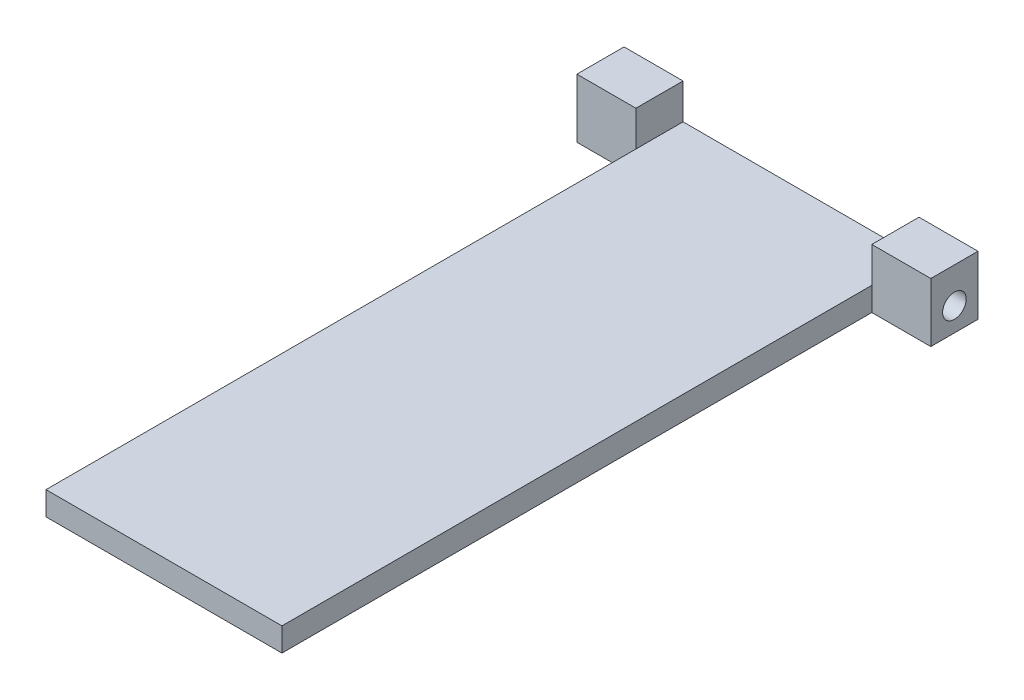
ISO-10303-21;
HEADER;
FILE_DESCRIPTION(('STEP AP214'),'2;1');
FILE_NAME('part.step','',(''),(''),'','','');
FILE_SCHEMA(('AUTOMOTIVE_DESIGN { 1 0 10303 214 1 1 1 1 }'));
ENDSEC;
DATA;
#1=APPLICATION_CONTEXT('core data for automotive mechanical design processes');
#2=APPLICATION_PROTOCOL_DEFINITION('international standard','automotive_design',2000,#1);
#3=PRODUCT_CONTEXT('',#1,'mechanical');
#4=PRODUCT('Part','Part','',(#3));
#5=PRODUCT_RELATED_PRODUCT_CATEGORY('part','',(#4));
#6=PRODUCT_DEFINITION_FORMATION('','',#4);
#7=PRODUCT_DEFINITION_CONTEXT('part definition',#1,'design');
#8=PRODUCT_DEFINITION('design','',#6,#7);
#9=PRODUCT_DEFINITION_SHAPE('','',#8);
#10=(LENGTH_UNIT() NAMED_UNIT(*) SI_UNIT(.MILLI.,.METRE.));
#11=(NAMED_UNIT(*) PLANE_ANGLE_UNIT() SI_UNIT($,.RADIAN.));
#12=(NAMED_UNIT(*) SI_UNIT($,.STERADIAN.) SOLID_ANGLE_UNIT());
#13=UNCERTAINTY_MEASURE_WITH_UNIT(LENGTH_MEASURE(1.E-05),#10,'distance_accuracy_value','');
#14=(GEOMETRIC_REPRESENTATION_CONTEXT(3) GLOBAL_UNCERTAINTY_ASSIGNED_CONTEXT((#13)) GLOBAL_UNIT_ASSIGNED_CONTEXT((#10,
#11,#12)) REPRESENTATION_CONTEXT('',''));
#15=CARTESIAN_POINT('',(0.,0.,0.));
#16=DIRECTION('',(0.,0.,1.));
#17=DIRECTION('',(1.,0.,0.));
#18=AXIS2_PLACEMENT_3D('',#15,#16,#17);
#19=CARTESIAN_POINT('',(-50.,-40.,85.));
#20=DIRECTION('',(-1.,0.,0.));
#21=DIRECTION('',(0.,-1.,0.));
#22=AXIS2_PLACEMENT_3D('',#19,#20,#21);
#23=PLANE('',#22);
#24=DIRECTION('',(0.,1.,0.));
#25=VECTOR('',#24,1.);
#26=CARTESIAN_POINT('',(-50.,-50.,-65.));
#27=LINE('',#26,#25);
#28=CARTESIAN_POINT('',(-50.,-50.,-65.));
#29=VERTEX_POINT('',#28);
#30=CARTESIAN_POINT('',(-50.,-40.,-65.));
#31=VERTEX_POINT('',#30);
#32=EDGE_CURVE('E69',#29,#31,#27,.T.);
#33=ORIENTED_EDGE('',*,*,#32,.F.);
#34=DIRECTION('',(0.,0.,-1.));
#35=VECTOR('',#34,1.);
#36=CARTESIAN_POINT('',(-50.,-50.,85.));
#37=LINE('',#36,#35);
#38=CARTESIAN_POINT('',(-50.,-50.,185.));
#39=VERTEX_POINT('',#38);
#40=EDGE_CURVE('E242',#39,#29,#37,.T.);
#41=ORIENTED_EDGE('',*,*,#40,.F.);
#42=DIRECTION('',(0.,-1.,0.));
#43=VECTOR('',#42,1.);
#44=CARTESIAN_POINT('',(-50.,-50.,185.));
#45=LINE('',#44,#43);
#46=CARTESIAN_POINT('',(-50.,-40.,185.));
#47=VERTEX_POINT('',#46);
#48=EDGE_CURVE('E152',#47,#39,#45,.T.);
#49=ORIENTED_EDGE('',*,*,#48,.F.);
#50=DIRECTION('',(0.,0.,-1.));
#51=VECTOR('',#50,1.);
#52=CARTESIAN_POINT('',(-50.,-40.,85.));
#53=LINE('',#52,#51);
#54=EDGE_CURVE('E243',#47,#31,#53,.T.);
#55=ORIENTED_EDGE('',*,*,#54,.T.);
#56=EDGE_LOOP('',(#33,#41,#49,#55));
#57=FACE_BOUND('',#56,.T.);
#58=ADVANCED_FACE('F45',(#57),#23,.T.);
#59=CARTESIAN_POINT('',(50.,-40.,-85.));
#60=DIRECTION('',(1.,0.,0.));
#61=DIRECTION('',(0.,1.,0.));
#62=AXIS2_PLACEMENT_3D('',#59,#60,#61);
#63=PLANE('',#62);
#64=DIRECTION('',(0.,-1.,0.));
#65=VECTOR('',#64,1.);
#66=CARTESIAN_POINT('',(50.,-50.,-65.));
#67=LINE('',#66,#65);
#68=CARTESIAN_POINT('',(50.,-40.,-65.));
#69=VERTEX_POINT('',#68);
#70=CARTESIAN_POINT('',(50.,-50.,-65.));
#71=VERTEX_POINT('',#70);
#72=EDGE_CURVE('E11',#69,#71,#67,.T.);
#73=ORIENTED_EDGE('',*,*,#72,.F.);
#74=DIRECTION('',(0.,0.,1.));
#75=VECTOR('',#74,1.);
#76=CARTESIAN_POINT('',(50.,-40.,-85.));
#77=LINE('',#76,#75);
#78=CARTESIAN_POINT('',(50.,-40.,185.));
#79=VERTEX_POINT('',#78);
#80=EDGE_CURVE('E142',#69,#79,#77,.T.);
#81=ORIENTED_EDGE('',*,*,#80,.T.);
#82=DIRECTION('',(0.,1.,0.));
#83=VECTOR('',#82,1.);
#84=CARTESIAN_POINT('',(50.,-40.,185.));
#85=LINE('',#84,#83);
#86=CARTESIAN_POINT('',(50.,-50.,185.));
#87=VERTEX_POINT('',#86);
#88=EDGE_CURVE('E140',#87,#79,#85,.T.);
#89=ORIENTED_EDGE('',*,*,#88,.F.);
#90=DIRECTION('',(0.,0.,1.));
#91=VECTOR('',#90,1.);
#92=CARTESIAN_POINT('',(50.,-50.,-85.));
#93=LINE('',#92,#91);
#94=EDGE_CURVE('E48',#71,#87,#93,.T.);
#95=ORIENTED_EDGE('',*,*,#94,.F.);
#96=EDGE_LOOP('',(#73,#81,#89,#95));
#97=FACE_BOUND('',#96,.T.);
#98=ADVANCED_FACE('F141',(#97),#63,.T.);
#99=CARTESIAN_POINT('',(-50.,-40.,-85.));
#100=DIRECTION('',(0.,0.,-1.));
#101=DIRECTION('',(-1.,0.,0.));
#102=AXIS2_PLACEMENT_3D('',#99,#100,#101);
#103=PLANE('',#102);
#104=DIRECTION('',(1.,0.,0.));
#105=VECTOR('',#104,1.);
#106=CARTESIAN_POINT('',(-50.,-50.,-85.));
#107=LINE('',#106,#105);
#108=CARTESIAN_POINT('',(-75.,-50.,-85.));
#109=VERTEX_POINT('',#108);
#110=CARTESIAN_POINT('',(75.,-50.,-85.));
#111=VERTEX_POINT('',#110);
#112=EDGE_CURVE('E138',#109,#111,#107,.T.);
#113=ORIENTED_EDGE('',*,*,#112,.F.);
#114=DIRECTION('',(0.,-1.,0.));
#115=VECTOR('',#114,1.);
#116=CARTESIAN_POINT('',(-75.,-25.,-85.));
#117=LINE('',#116,#115);
#118=CARTESIAN_POINT('',(-75.,-25.,-85.));
#119=VERTEX_POINT('',#118);
#120=EDGE_CURVE('E208',#119,#109,#117,.T.);
#121=ORIENTED_EDGE('',*,*,#120,.F.);
#122=DIRECTION('',(1.,0.,0.));
#123=VECTOR('',#122,1.);
#124=CARTESIAN_POINT('',(-75.,-25.,-85.));
#125=LINE('',#124,#123);
#126=CARTESIAN_POINT('',(-50.,-25.,-85.));
#127=VERTEX_POINT('',#126);
#128=EDGE_CURVE('E222',#119,#127,#125,.T.);
#129=ORIENTED_EDGE('',*,*,#128,.T.);
#130=DIRECTION('',(0.,-1.,0.));
#131=VECTOR('',#130,1.);
#132=CARTESIAN_POINT('',(-50.,-25.,-85.));
#133=LINE('',#132,#131);
#134=CARTESIAN_POINT('',(-50.,-40.,-85.));
#135=VERTEX_POINT('',#134);
#136=EDGE_CURVE('E207',#127,#135,#133,.T.);
#137=ORIENTED_EDGE('',*,*,#136,.T.);
#138=DIRECTION('',(1.,0.,0.));
#139=VECTOR('',#138,1.);
#140=CARTESIAN_POINT('',(-50.,-40.,-85.));
#141=LINE('',#140,#139);
#142=CARTESIAN_POINT('',(50.,-40.,-85.));
#143=VERTEX_POINT('',#142);
#144=EDGE_CURVE('E246',#135,#143,#141,.T.);
#145=ORIENTED_EDGE('',*,*,#144,.T.);
#146=DIRECTION('',(0.,1.,0.));
#147=VECTOR('',#146,1.);
#148=CARTESIAN_POINT('',(50.,-25.,-85.));
#149=LINE('',#148,#147);
#150=CARTESIAN_POINT('',(50.,-25.,-85.));
#151=VERTEX_POINT('',#150);
#152=EDGE_CURVE('E173',#143,#151,#149,.T.);
#153=ORIENTED_EDGE('',*,*,#152,.T.);
#154=DIRECTION('',(-1.,0.,0.));
#155=VECTOR('',#154,1.);
#156=CARTESIAN_POINT('',(75.,-25.,-85.));
#157=LINE('',#156,#155);
#158=CARTESIAN_POINT('',(75.,-25.,-85.));
#159=VERTEX_POINT('',#158);
#160=EDGE_CURVE('E203',#159,#151,#157,.T.);
#161=ORIENTED_EDGE('',*,*,#160,.F.);
#162=DIRECTION('',(0.,1.,0.));
#163=VECTOR('',#162,1.);
#164=CARTESIAN_POINT('',(75.,-25.,-85.));
#165=LINE('',#164,#163);
#166=EDGE_CURVE('E181',#111,#159,#165,.T.);
#167=ORIENTED_EDGE('',*,*,#166,.F.);
#168=EDGE_LOOP('',(#113,#121,#129,#137,#145,#153,#161,#167));
#169=FACE_BOUND('',#168,.T.);
#170=ADVANCED_FACE('F261',(#169),#103,.T.);
#171=CARTESIAN_POINT('',(0.,-40.,0.));
#172=DIRECTION('',(0.,-1.,0.));
#173=DIRECTION('',(1.,0.,0.));
#174=AXIS2_PLACEMENT_3D('',#171,#172,#173);
#175=PLANE('',#174);
#176=ORIENTED_EDGE('',*,*,#54,.F.);
#177=DIRECTION('',(-1.,0.,0.));
#178=VECTOR('',#177,1.);
#179=CARTESIAN_POINT('',(-50.,-40.,185.));
#180=LINE('',#179,#178);
#181=EDGE_CURVE('E147',#79,#47,#180,.T.);
#182=ORIENTED_EDGE('',*,*,#181,.F.);
#183=ORIENTED_EDGE('',*,*,#80,.F.);
#184=EDGE_CURVE('E54',#143,#69,#77,.T.);
#185=ORIENTED_EDGE('',*,*,#184,.F.);
#186=ORIENTED_EDGE('',*,*,#144,.F.);
#187=EDGE_CURVE('E137',#31,#135,#53,.T.);
#188=ORIENTED_EDGE('',*,*,#187,.F.);
#189=EDGE_LOOP('',(#176,#182,#183,#185,#186,#188));
#190=FACE_BOUND('',#189,.T.);
#191=ADVANCED_FACE('F275',(#190),#175,.F.);
#192=CARTESIAN_POINT('',(0.,-50.,0.));
#193=DIRECTION('',(0.,-1.,0.));
#194=DIRECTION('',(1.,0.,0.));
#195=AXIS2_PLACEMENT_3D('',#192,#193,#194);
#196=PLANE('',#195);
#197=ORIENTED_EDGE('',*,*,#40,.T.);
#198=DIRECTION('',(1.,0.,0.));
#199=VECTOR('',#198,1.);
#200=CARTESIAN_POINT('',(-75.,-50.,-65.));
#201=LINE('',#200,#199);
#202=CARTESIAN_POINT('',(-75.,-50.,-65.));
#203=VERTEX_POINT('',#202);
#204=EDGE_CURVE('E238',#203,#29,#201,.T.);
#205=ORIENTED_EDGE('',*,*,#204,.F.);
#206=DIRECTION('',(0.,0.,1.));
#207=VECTOR('',#206,1.);
#208=CARTESIAN_POINT('',(-75.,-50.,-85.));
#209=LINE('',#208,#207);
#210=EDGE_CURVE('E212',#109,#203,#209,.T.);
#211=ORIENTED_EDGE('',*,*,#210,.F.);
#212=ORIENTED_EDGE('',*,*,#112,.T.);
#213=DIRECTION('',(0.,0.,-1.));
#214=VECTOR('',#213,1.);
#215=CARTESIAN_POINT('',(75.,-50.,-85.));
#216=LINE('',#215,#214);
#217=CARTESIAN_POINT('',(75.,-50.,-65.));
#218=VERTEX_POINT('',#217);
#219=EDGE_CURVE('E177',#218,#111,#216,.T.);
#220=ORIENTED_EDGE('',*,*,#219,.F.);
#221=DIRECTION('',(-1.,0.,0.));
#222=VECTOR('',#221,1.);
#223=CARTESIAN_POINT('',(75.,-50.,-65.));
#224=LINE('',#223,#222);
#225=EDGE_CURVE('E135',#218,#71,#224,.T.);
#226=ORIENTED_EDGE('',*,*,#225,.T.);
#227=ORIENTED_EDGE('',*,*,#94,.T.);
#228=DIRECTION('',(1.,0.,0.));
#229=VECTOR('',#228,1.);
#230=CARTESIAN_POINT('',(50.,-50.,185.));
#231=LINE('',#230,#229);
#232=EDGE_CURVE('E132',#39,#87,#231,.T.);
#233=ORIENTED_EDGE('',*,*,#232,.F.);
#234=EDGE_LOOP('',(#197,#205,#211,#212,#220,#226,#227,#233));
#235=FACE_BOUND('',#234,.T.);
#236=ADVANCED_FACE('F130',(#235),#196,.T.);
#237=CARTESIAN_POINT('',(-50.,0.,0.));
#238=DIRECTION('',(-1.,0.,0.));
#239=DIRECTION('',(0.,0.,1.));
#240=AXIS2_PLACEMENT_3D('',#237,#238,#239);
#241=PLANE('',#240);
#242=CARTESIAN_POINT('',(-50.,-25.,-65.));
#243=VERTEX_POINT('',#242);
#244=EDGE_CURVE('E226',#31,#243,#27,.T.);
#245=ORIENTED_EDGE('',*,*,#244,.F.);
#246=ORIENTED_EDGE('',*,*,#187,.T.);
#247=ORIENTED_EDGE('',*,*,#136,.F.);
#248=DIRECTION('',(0.,0.,-1.));
#249=VECTOR('',#248,1.);
#250=CARTESIAN_POINT('',(-50.,-25.,-65.));
#251=LINE('',#250,#249);
#252=EDGE_CURVE('E213',#243,#127,#251,.T.);
#253=ORIENTED_EDGE('',*,*,#252,.F.);
#254=EDGE_LOOP('',(#245,#246,#247,#253));
#255=FACE_BOUND('',#254,.T.);
#256=ADVANCED_FACE('F283',(#255),#241,.F.);
#257=CARTESIAN_POINT('',(-75.,-50.,-65.));
#258=DIRECTION('',(0.,0.,-1.));
#259=DIRECTION('',(-1.,0.,0.));
#260=AXIS2_PLACEMENT_3D('',#257,#258,#259);
#261=PLANE('',#260);
#262=ORIENTED_EDGE('',*,*,#32,.T.);
#263=ORIENTED_EDGE('',*,*,#244,.T.);
#264=DIRECTION('',(1.,0.,0.));
#265=VECTOR('',#264,1.);
#266=CARTESIAN_POINT('',(-75.,-25.,-65.));
#267=LINE('',#266,#265);
#268=CARTESIAN_POINT('',(-75.,-25.,-65.));
#269=VERTEX_POINT('',#268);
#270=EDGE_CURVE('E234',#269,#243,#267,.T.);
#271=ORIENTED_EDGE('',*,*,#270,.F.);
#272=DIRECTION('',(0.,1.,0.));
#273=VECTOR('',#272,1.);
#274=CARTESIAN_POINT('',(-75.,-50.,-65.));
#275=LINE('',#274,#273);
#276=EDGE_CURVE('E216',#203,#269,#275,.T.);
#277=ORIENTED_EDGE('',*,*,#276,.F.);
#278=ORIENTED_EDGE('',*,*,#204,.T.);
#279=EDGE_LOOP('',(#262,#263,#271,#277,#278));
#280=FACE_BOUND('',#279,.T.);
#281=ADVANCED_FACE('F288',(#280),#261,.F.);
#282=CARTESIAN_POINT('',(-75.,-25.,-65.));
#283=DIRECTION('',(0.,-1.,0.));
#284=DIRECTION('',(1.,0.,0.));
#285=AXIS2_PLACEMENT_3D('',#282,#283,#284);
#286=PLANE('',#285);
#287=ORIENTED_EDGE('',*,*,#252,.T.);
#288=ORIENTED_EDGE('',*,*,#128,.F.);
#289=DIRECTION('',(0.,0.,-1.));
#290=VECTOR('',#289,1.);
#291=CARTESIAN_POINT('',(-75.,-25.,-65.));
#292=LINE('',#291,#290);
#293=EDGE_CURVE('E219',#269,#119,#292,.T.);
#294=ORIENTED_EDGE('',*,*,#293,.F.);
#295=ORIENTED_EDGE('',*,*,#270,.T.);
#296=EDGE_LOOP('',(#287,#288,#294,#295));
#297=FACE_BOUND('',#296,.T.);
#298=ADVANCED_FACE('F294',(#297),#286,.F.);
#299=CARTESIAN_POINT('',(-75.,0.,0.));
#300=DIRECTION('',(-1.,0.,0.));
#301=DIRECTION('',(0.,0.,1.));
#302=AXIS2_PLACEMENT_3D('',#299,#300,#301);
#303=PLANE('',#302);
#304=CARTESIAN_POINT('',(-75.,-40.,-75.));
#305=DIRECTION('',(-1.,0.,0.));
#306=DIRECTION('',(0.,0.,1.));
#307=AXIS2_PLACEMENT_3D('',#304,#305,#306);
#308=CIRCLE('',#307,5.00000000000001);
#309=CARTESIAN_POINT('',(-75.,-40.,-70.));
#310=VERTEX_POINT('',#309);
#311=EDGE_CURVE('E165',#310,#310,#308,.T.);
#312=ORIENTED_EDGE('',*,*,#311,.F.);
#313=EDGE_LOOP('',(#312));
#314=FACE_BOUND('',#313,.T.);
#315=ORIENTED_EDGE('',*,*,#120,.T.);
#316=ORIENTED_EDGE('',*,*,#210,.T.);
#317=ORIENTED_EDGE('',*,*,#276,.T.);
#318=ORIENTED_EDGE('',*,*,#293,.T.);
#319=EDGE_LOOP('',(#315,#316,#317,#318));
#320=FACE_BOUND('',#319,.T.);
#321=ADVANCED_FACE('F292',(#314,#320),#303,.T.);
#322=CARTESIAN_POINT('',(75.,-25.,-65.));
#323=DIRECTION('',(0.,-1.,0.));
#324=DIRECTION('',(1.,0.,0.));
#325=AXIS2_PLACEMENT_3D('',#322,#323,#324);
#326=PLANE('',#325);
#327=DIRECTION('',(0.,0.,1.));
#328=VECTOR('',#327,1.);
#329=CARTESIAN_POINT('',(50.,-25.,-65.));
#330=LINE('',#329,#328);
#331=CARTESIAN_POINT('',(50.,-25.,-65.));
#332=VERTEX_POINT('',#331);
#333=EDGE_CURVE('E192',#151,#332,#330,.T.);
#334=ORIENTED_EDGE('',*,*,#333,.T.);
#335=DIRECTION('',(-1.,0.,0.));
#336=VECTOR('',#335,1.);
#337=CARTESIAN_POINT('',(75.,-25.,-65.));
#338=LINE('',#337,#336);
#339=CARTESIAN_POINT('',(75.,-25.,-65.));
#340=VERTEX_POINT('',#339);
#341=EDGE_CURVE('E199',#340,#332,#338,.T.);
#342=ORIENTED_EDGE('',*,*,#341,.F.);
#343=DIRECTION('',(0.,0.,1.));
#344=VECTOR('',#343,1.);
#345=CARTESIAN_POINT('',(75.,-25.,-65.));
#346=LINE('',#345,#344);
#347=EDGE_CURVE('E184',#159,#340,#346,.T.);
#348=ORIENTED_EDGE('',*,*,#347,.F.);
#349=ORIENTED_EDGE('',*,*,#160,.T.);
#350=EDGE_LOOP('',(#334,#342,#348,#349));
#351=FACE_BOUND('',#350,.T.);
#352=ADVANCED_FACE('F302',(#351),#326,.F.);
#353=CARTESIAN_POINT('',(75.,-50.,-65.));
#354=DIRECTION('',(0.,0.,-1.));
#355=DIRECTION('',(0.,1.,0.));
#356=AXIS2_PLACEMENT_3D('',#353,#354,#355);
#357=PLANE('',#356);
#358=EDGE_CURVE('E56',#332,#69,#67,.T.);
#359=ORIENTED_EDGE('',*,*,#358,.T.);
#360=ORIENTED_EDGE('',*,*,#72,.T.);
#361=ORIENTED_EDGE('',*,*,#225,.F.);
#362=DIRECTION('',(0.,-1.,0.));
#363=VECTOR('',#362,1.);
#364=CARTESIAN_POINT('',(75.,-50.,-65.));
#365=LINE('',#364,#363);
#366=EDGE_CURVE('E187',#340,#218,#365,.T.);
#367=ORIENTED_EDGE('',*,*,#366,.F.);
#368=ORIENTED_EDGE('',*,*,#341,.T.);
#369=EDGE_LOOP('',(#359,#360,#361,#367,#368));
#370=FACE_BOUND('',#369,.T.);
#371=ADVANCED_FACE('F268',(#370),#357,.F.);
#372=CARTESIAN_POINT('',(75.,0.,0.));
#373=DIRECTION('',(-1.,0.,0.));
#374=DIRECTION('',(0.,0.,1.));
#375=AXIS2_PLACEMENT_3D('',#372,#373,#374);
#376=PLANE('',#375);
#377=CARTESIAN_POINT('',(75.,-40.,-75.));
#378=DIRECTION('',(1.,0.,0.));
#379=DIRECTION('',(0.,0.,-1.));
#380=AXIS2_PLACEMENT_3D('',#377,#378,#379);
#381=CIRCLE('',#380,5.00000000000001);
#382=CARTESIAN_POINT('',(75.,-40.,-80.));
#383=VERTEX_POINT('',#382);
#384=EDGE_CURVE('E160',#383,#383,#381,.T.);
#385=ORIENTED_EDGE('',*,*,#384,.F.);
#386=EDGE_LOOP('',(#385));
#387=FACE_BOUND('',#386,.T.);
#388=ORIENTED_EDGE('',*,*,#219,.T.);
#389=ORIENTED_EDGE('',*,*,#166,.T.);
#390=ORIENTED_EDGE('',*,*,#347,.T.);
#391=ORIENTED_EDGE('',*,*,#366,.T.);
#392=EDGE_LOOP('',(#388,#389,#390,#391));
#393=FACE_BOUND('',#392,.T.);
#394=ADVANCED_FACE('F264',(#387,#393),#376,.F.);
#395=CARTESIAN_POINT('',(50.,0.,0.));
#396=DIRECTION('',(-1.,0.,0.));
#397=DIRECTION('',(0.,0.,1.));
#398=AXIS2_PLACEMENT_3D('',#395,#396,#397);
#399=PLANE('',#398);
#400=ORIENTED_EDGE('',*,*,#152,.F.);
#401=ORIENTED_EDGE('',*,*,#184,.T.);
#402=ORIENTED_EDGE('',*,*,#358,.F.);
#403=ORIENTED_EDGE('',*,*,#333,.F.);
#404=EDGE_LOOP('',(#400,#401,#402,#403));
#405=FACE_BOUND('',#404,.T.);
#406=ADVANCED_FACE('F273',(#405),#399,.T.);
#407=CARTESIAN_POINT('',(-55.,-40.,-75.));
#408=DIRECTION('',(-1.,0.,0.));
#409=DIRECTION('',(0.,0.,1.));
#410=AXIS2_PLACEMENT_3D('',#407,#408,#409);
#411=CYLINDRICAL_SURFACE('',#410,5.00000000000001);
#412=CARTESIAN_POINT('',(-55.,-40.,-75.));
#413=DIRECTION('',(-1.,0.,0.));
#414=DIRECTION('',(0.,0.,1.));
#415=AXIS2_PLACEMENT_3D('',#412,#413,#414);
#416=CIRCLE('',#415,5.00000000000001);
#417=CARTESIAN_POINT('',(-55.,-40.,-70.));
#418=VERTEX_POINT('',#417);
#419=EDGE_CURVE('E169',#418,#418,#416,.T.);
#420=ORIENTED_EDGE('',*,*,#419,.F.);
#421=EDGE_LOOP('',(#420));
#422=FACE_BOUND('',#421,.T.);
#423=ORIENTED_EDGE('',*,*,#311,.T.);
#424=EDGE_LOOP('',(#423));
#425=FACE_BOUND('',#424,.T.);
#426=ADVANCED_FACE('F360',(#422,#425),#411,.F.);
#427=CARTESIAN_POINT('',(-55.,-40.,-75.));
#428=DIRECTION('',(-1.,0.,0.));
#429=DIRECTION('',(0.,0.,1.));
#430=AXIS2_PLACEMENT_3D('',#427,#428,#429);
#431=PLANE('',#430);
#432=ORIENTED_EDGE('',*,*,#419,.T.);
#433=EDGE_LOOP('',(#432));
#434=FACE_BOUND('',#433,.T.);
#435=ADVANCED_FACE('F351',(#434),#431,.T.);
#436=CARTESIAN_POINT('',(55.,-40.,-75.));
#437=DIRECTION('',(1.,0.,0.));
#438=DIRECTION('',(0.,0.,-1.));
#439=AXIS2_PLACEMENT_3D('',#436,#437,#438);
#440=CYLINDRICAL_SURFACE('',#439,5.00000000000001);
#441=CARTESIAN_POINT('',(55.,-40.,-75.));
#442=DIRECTION('',(1.,0.,0.));
#443=DIRECTION('',(0.,0.,-1.));
#444=AXIS2_PLACEMENT_3D('',#441,#442,#443);
#445=CIRCLE('',#444,5.00000000000001);
#446=CARTESIAN_POINT('',(55.,-40.,-80.));
#447=VERTEX_POINT('',#446);
#448=EDGE_CURVE('E161',#447,#447,#445,.T.);
#449=ORIENTED_EDGE('',*,*,#448,.F.);
#450=EDGE_LOOP('',(#449));
#451=FACE_BOUND('',#450,.T.);
#452=ORIENTED_EDGE('',*,*,#384,.T.);
#453=EDGE_LOOP('',(#452));
#454=FACE_BOUND('',#453,.T.);
#455=ADVANCED_FACE('F342',(#451,#454),#440,.F.);
#456=CARTESIAN_POINT('',(55.,-40.,-75.));
#457=DIRECTION('',(1.,0.,0.));
#458=DIRECTION('',(0.,0.,-1.));
#459=AXIS2_PLACEMENT_3D('',#456,#457,#458);
#460=PLANE('',#459);
#461=ORIENTED_EDGE('',*,*,#448,.T.);
#462=EDGE_LOOP('',(#461));
#463=FACE_BOUND('',#462,.T.);
#464=ADVANCED_FACE('F332',(#463),#460,.T.);
#465=CARTESIAN_POINT('',(0.,0.,185.));
#466=DIRECTION('',(0.,0.,-1.));
#467=DIRECTION('',(-1.,0.,0.));
#468=AXIS2_PLACEMENT_3D('',#465,#466,#467);
#469=PLANE('',#468);
#470=ORIENTED_EDGE('',*,*,#232,.T.);
#471=ORIENTED_EDGE('',*,*,#88,.T.);
#472=ORIENTED_EDGE('',*,*,#181,.T.);
#473=ORIENTED_EDGE('',*,*,#48,.T.);
#474=EDGE_LOOP('',(#470,#471,#472,#473));
#475=FACE_BOUND('',#474,.T.);
#476=ADVANCED_FACE('F150',(#475),#469,.F.);
#477=CLOSED_SHELL('',(#58,#98,#170,#191,#236,#256,#281,#298,#321,#352,#371,#394,#406,#426,#435,
#455,#464,#476));
#478=MANIFOLD_SOLID_BREP('B2',#477);
#479=ADVANCED_BREP_SHAPE_REPRESENTATION('',(#18,#478),#14);
#480=SHAPE_DEFINITION_REPRESENTATION(#9,#479);
ENDSEC;
END-ISO-10303-21;
